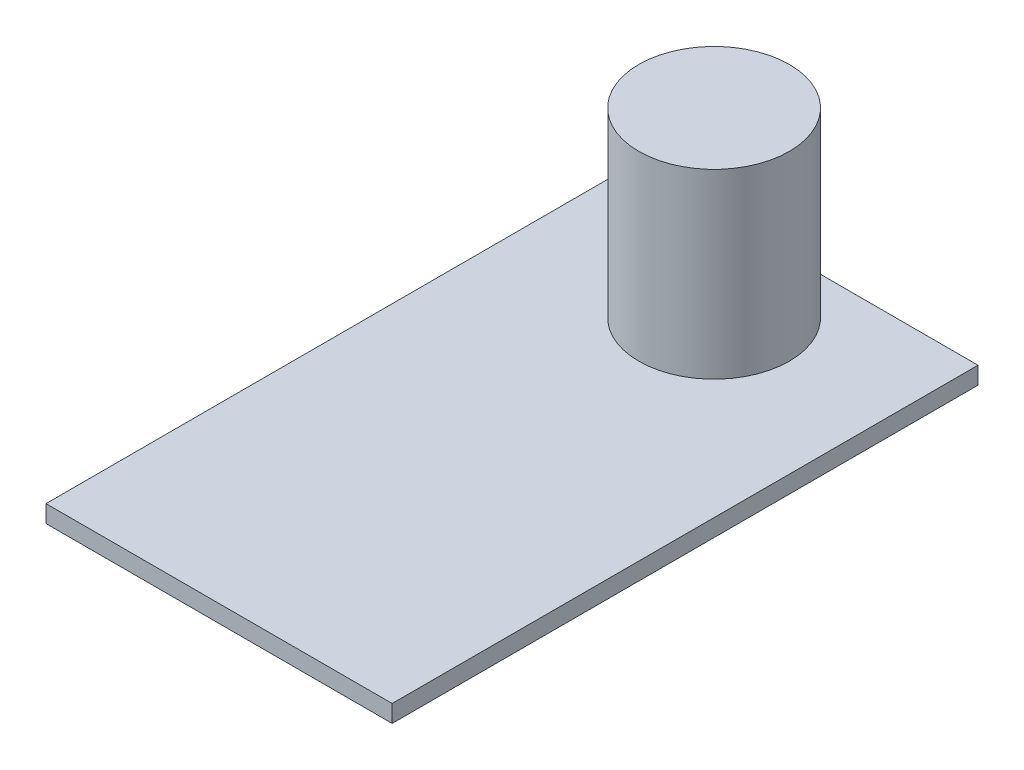
ISO-10303-21;
HEADER;
FILE_DESCRIPTION(('STEP AP214'),'2;1');
FILE_NAME('part.step','',(''),(''),'','','');
FILE_SCHEMA(('AUTOMOTIVE_DESIGN { 1 0 10303 214 1 1 1 1 }'));
ENDSEC;
DATA;
#1=APPLICATION_CONTEXT('core data for automotive mechanical design processes');
#2=APPLICATION_PROTOCOL_DEFINITION('international standard','automotive_design',2000,#1);
#3=PRODUCT_CONTEXT('',#1,'mechanical');
#4=PRODUCT('Part','Part','',(#3));
#5=PRODUCT_RELATED_PRODUCT_CATEGORY('part','',(#4));
#6=PRODUCT_DEFINITION_FORMATION('','',#4);
#7=PRODUCT_DEFINITION_CONTEXT('part definition',#1,'design');
#8=PRODUCT_DEFINITION('design','',#6,#7);
#9=PRODUCT_DEFINITION_SHAPE('','',#8);
#10=(LENGTH_UNIT() NAMED_UNIT(*) SI_UNIT(.MILLI.,.METRE.));
#11=(NAMED_UNIT(*) PLANE_ANGLE_UNIT() SI_UNIT($,.RADIAN.));
#12=(NAMED_UNIT(*) SI_UNIT($,.STERADIAN.) SOLID_ANGLE_UNIT());
#13=UNCERTAINTY_MEASURE_WITH_UNIT(LENGTH_MEASURE(1.E-05),#10,'distance_accuracy_value','');
#14=(GEOMETRIC_REPRESENTATION_CONTEXT(3) GLOBAL_UNCERTAINTY_ASSIGNED_CONTEXT((#13)) GLOBAL_UNIT_ASSIGNED_CONTEXT((#10,
#11,#12)) REPRESENTATION_CONTEXT('',''));
#15=CARTESIAN_POINT('',(0.,0.,0.));
#16=DIRECTION('',(0.,0.,1.));
#17=DIRECTION('',(1.,0.,0.));
#18=AXIS2_PLACEMENT_3D('',#15,#16,#17);
#19=CARTESIAN_POINT('',(0.,2.,0.));
#20=DIRECTION('',(0.,1.,0.));
#21=DIRECTION('',(0.,0.,1.));
#22=AXIS2_PLACEMENT_3D('',#19,#20,#21);
#23=PLANE('',#22);
#24=DIRECTION('',(0.,0.,1.));
#25=VECTOR('',#24,1.);
#26=CARTESIAN_POINT('',(-40.,2.,-67.7));
#27=LINE('',#26,#25);
#28=CARTESIAN_POINT('',(-40.,2.,-67.7));
#29=VERTEX_POINT('',#28);
#30=CARTESIAN_POINT('',(-40.,2.,0.));
#31=VERTEX_POINT('',#30);
#32=EDGE_CURVE('E88',#29,#31,#27,.T.);
#33=ORIENTED_EDGE('',*,*,#32,.T.);
#34=DIRECTION('',(1.,0.,0.));
#35=VECTOR('',#34,1.);
#36=CARTESIAN_POINT('',(-40.,2.,0.));
#37=LINE('',#36,#35);
#38=CARTESIAN_POINT('',(0.,2.,0.));
#39=VERTEX_POINT('',#38);
#40=EDGE_CURVE('E83',#31,#39,#37,.T.);
#41=ORIENTED_EDGE('',*,*,#40,.T.);
#42=DIRECTION('',(0.,0.,-1.));
#43=VECTOR('',#42,1.);
#44=CARTESIAN_POINT('',(0.,2.,-67.7));
#45=LINE('',#44,#43);
#46=CARTESIAN_POINT('',(0.,2.,-67.7));
#47=VERTEX_POINT('',#46);
#48=EDGE_CURVE('E86',#39,#47,#45,.T.);
#49=ORIENTED_EDGE('',*,*,#48,.T.);
#50=DIRECTION('',(-1.,0.,0.));
#51=VECTOR('',#50,1.);
#52=CARTESIAN_POINT('',(-40.,2.,-67.7));
#53=LINE('',#52,#51);
#54=EDGE_CURVE('E53',#47,#29,#53,.T.);
#55=ORIENTED_EDGE('',*,*,#54,.T.);
#56=EDGE_LOOP('',(#33,#41,#49,#55));
#57=FACE_BOUND('',#56,.T.);
#58=CARTESIAN_POINT('',(-20.,2.,-57.2));
#59=DIRECTION('',(0.,1.,0.));
#60=DIRECTION('',(0.,0.,1.));
#61=AXIS2_PLACEMENT_3D('',#58,#59,#60);
#62=CIRCLE('',#61,8.7);
#63=CARTESIAN_POINT('',(-20.,2.,-65.9));
#64=VERTEX_POINT('',#63);
#65=EDGE_CURVE('E114',#64,#64,#62,.T.);
#66=ORIENTED_EDGE('',*,*,#65,.F.);
#67=EDGE_LOOP('',(#66));
#68=FACE_BOUND('',#67,.T.);
#69=ADVANCED_FACE('F36',(#57,#68),#23,.T.);
#70=CARTESIAN_POINT('',(-40.,2.,-67.7));
#71=DIRECTION('',(1.,0.,0.));
#72=DIRECTION('',(0.,0.,-1.));
#73=AXIS2_PLACEMENT_3D('',#70,#71,#72);
#74=PLANE('',#73);
#75=DIRECTION('',(0.,0.,1.));
#76=VECTOR('',#75,1.);
#77=CARTESIAN_POINT('',(-40.,0.,-67.7));
#78=LINE('',#77,#76);
#79=CARTESIAN_POINT('',(-40.,0.,-67.7));
#80=VERTEX_POINT('',#79);
#81=CARTESIAN_POINT('',(-40.,0.,0.));
#82=VERTEX_POINT('',#81);
#83=EDGE_CURVE('E100',#80,#82,#78,.T.);
#84=ORIENTED_EDGE('',*,*,#83,.T.);
#85=DIRECTION('',(0.,-1.,0.));
#86=VECTOR('',#85,1.);
#87=CARTESIAN_POINT('',(-40.,2.,0.));
#88=LINE('',#87,#86);
#89=EDGE_CURVE('E11',#31,#82,#88,.T.);
#90=ORIENTED_EDGE('',*,*,#89,.F.);
#91=ORIENTED_EDGE('',*,*,#32,.F.);
#92=DIRECTION('',(0.,-1.,0.));
#93=VECTOR('',#92,1.);
#94=CARTESIAN_POINT('',(-40.,2.,-67.7));
#95=LINE('',#94,#93);
#96=EDGE_CURVE('E96',#29,#80,#95,.T.);
#97=ORIENTED_EDGE('',*,*,#96,.T.);
#98=EDGE_LOOP('',(#84,#90,#91,#97));
#99=FACE_BOUND('',#98,.T.);
#100=ADVANCED_FACE('F38',(#99),#74,.F.);
#101=CARTESIAN_POINT('',(-40.,2.,0.));
#102=DIRECTION('',(0.,0.,-1.));
#103=DIRECTION('',(-1.,0.,0.));
#104=AXIS2_PLACEMENT_3D('',#101,#102,#103);
#105=PLANE('',#104);
#106=DIRECTION('',(1.,0.,0.));
#107=VECTOR('',#106,1.);
#108=CARTESIAN_POINT('',(-40.,0.,0.));
#109=LINE('',#108,#107);
#110=CARTESIAN_POINT('',(0.,0.,0.));
#111=VERTEX_POINT('',#110);
#112=EDGE_CURVE('E92',#82,#111,#109,.T.);
#113=ORIENTED_EDGE('',*,*,#112,.T.);
#114=DIRECTION('',(0.,-1.,0.));
#115=VECTOR('',#114,1.);
#116=CARTESIAN_POINT('',(0.,2.,0.));
#117=LINE('',#116,#115);
#118=EDGE_CURVE('E45',#39,#111,#117,.T.);
#119=ORIENTED_EDGE('',*,*,#118,.F.);
#120=ORIENTED_EDGE('',*,*,#40,.F.);
#121=ORIENTED_EDGE('',*,*,#89,.T.);
#122=EDGE_LOOP('',(#113,#119,#120,#121));
#123=FACE_BOUND('',#122,.T.);
#124=ADVANCED_FACE('F91',(#123),#105,.F.);
#125=CARTESIAN_POINT('',(0.,2.,-67.7));
#126=DIRECTION('',(-1.,0.,0.));
#127=DIRECTION('',(0.,0.,1.));
#128=AXIS2_PLACEMENT_3D('',#125,#126,#127);
#129=PLANE('',#128);
#130=DIRECTION('',(0.,0.,-1.));
#131=VECTOR('',#130,1.);
#132=CARTESIAN_POINT('',(0.,0.,-67.7));
#133=LINE('',#132,#131);
#134=CARTESIAN_POINT('',(0.,0.,-67.7));
#135=VERTEX_POINT('',#134);
#136=EDGE_CURVE('E70',#111,#135,#133,.T.);
#137=ORIENTED_EDGE('',*,*,#136,.T.);
#138=DIRECTION('',(0.,-1.,0.));
#139=VECTOR('',#138,1.);
#140=CARTESIAN_POINT('',(0.,2.,-67.7));
#141=LINE('',#140,#139);
#142=EDGE_CURVE('E93',#47,#135,#141,.T.);
#143=ORIENTED_EDGE('',*,*,#142,.F.);
#144=ORIENTED_EDGE('',*,*,#48,.F.);
#145=ORIENTED_EDGE('',*,*,#118,.T.);
#146=EDGE_LOOP('',(#137,#143,#144,#145));
#147=FACE_BOUND('',#146,.T.);
#148=ADVANCED_FACE('F94',(#147),#129,.F.);
#149=CARTESIAN_POINT('',(-40.,2.,-67.7));
#150=DIRECTION('',(0.,0.,1.));
#151=DIRECTION('',(1.,0.,0.));
#152=AXIS2_PLACEMENT_3D('',#149,#150,#151);
#153=PLANE('',#152);
#154=DIRECTION('',(-1.,0.,0.));
#155=VECTOR('',#154,1.);
#156=CARTESIAN_POINT('',(-40.,0.,-67.7));
#157=LINE('',#156,#155);
#158=EDGE_CURVE('E76',#135,#80,#157,.T.);
#159=ORIENTED_EDGE('',*,*,#158,.T.);
#160=ORIENTED_EDGE('',*,*,#96,.F.);
#161=ORIENTED_EDGE('',*,*,#54,.F.);
#162=ORIENTED_EDGE('',*,*,#142,.T.);
#163=EDGE_LOOP('',(#159,#160,#161,#162));
#164=FACE_BOUND('',#163,.T.);
#165=ADVANCED_FACE('F108',(#164),#153,.F.);
#166=CARTESIAN_POINT('',(0.,0.,0.));
#167=DIRECTION('',(0.,1.,0.));
#168=DIRECTION('',(0.,0.,1.));
#169=AXIS2_PLACEMENT_3D('',#166,#167,#168);
#170=PLANE('',#169);
#171=ORIENTED_EDGE('',*,*,#83,.F.);
#172=ORIENTED_EDGE('',*,*,#158,.F.);
#173=ORIENTED_EDGE('',*,*,#136,.F.);
#174=ORIENTED_EDGE('',*,*,#112,.F.);
#175=EDGE_LOOP('',(#171,#172,#173,#174));
#176=FACE_BOUND('',#175,.T.);
#177=ADVANCED_FACE('F111',(#176),#170,.F.);
#178=CARTESIAN_POINT('',(-20.,23.,-57.2));
#179=DIRECTION('',(0.,-1.,0.));
#180=DIRECTION('',(0.,0.,-1.));
#181=AXIS2_PLACEMENT_3D('',#178,#179,#180);
#182=CYLINDRICAL_SURFACE('',#181,8.7);
#183=CARTESIAN_POINT('',(-20.,23.,-57.2));
#184=DIRECTION('',(0.,1.,0.));
#185=DIRECTION('',(0.,0.,1.));
#186=AXIS2_PLACEMENT_3D('',#183,#184,#185);
#187=CIRCLE('',#186,8.7);
#188=CARTESIAN_POINT('',(-20.,23.,-65.9));
#189=VERTEX_POINT('',#188);
#190=EDGE_CURVE('E103',#189,#189,#187,.T.);
#191=CARTESIAN_POINT('',(-20.,23.,-65.9));
#192=CARTESIAN_POINT('',(-20.,22.78125,-65.9));
#193=CARTESIAN_POINT('',(-20.,22.5625,-65.9));
#194=CARTESIAN_POINT('',(-20.,22.125,-65.9));
#195=CARTESIAN_POINT('',(-20.,21.90625,-65.9));
#196=CARTESIAN_POINT('',(-20.,21.46875,-65.9));
#197=CARTESIAN_POINT('',(-20.,21.25,-65.9));
#198=CARTESIAN_POINT('',(-20.,20.8125,-65.9));
#199=CARTESIAN_POINT('',(-20.,20.59375,-65.9));
#200=CARTESIAN_POINT('',(-20.,20.15625,-65.9));
#201=CARTESIAN_POINT('',(-20.,19.9375,-65.9));
#202=CARTESIAN_POINT('',(-20.,19.5,-65.9));
#203=CARTESIAN_POINT('',(-20.,19.28125,-65.9));
#204=CARTESIAN_POINT('',(-20.,18.84375,-65.9));
#205=CARTESIAN_POINT('',(-20.,18.625,-65.9));
#206=CARTESIAN_POINT('',(-20.,18.1875,-65.9));
#207=CARTESIAN_POINT('',(-20.,17.96875,-65.9));
#208=CARTESIAN_POINT('',(-20.,17.53125,-65.9));
#209=CARTESIAN_POINT('',(-20.,17.3125,-65.9));
#210=CARTESIAN_POINT('',(-20.,16.875,-65.9));
#211=CARTESIAN_POINT('',(-20.,16.65625,-65.9));
#212=CARTESIAN_POINT('',(-20.,16.21875,-65.9));
#213=CARTESIAN_POINT('',(-20.,16.,-65.9));
#214=CARTESIAN_POINT('',(-20.,15.5625,-65.9));
#215=CARTESIAN_POINT('',(-20.,15.34375,-65.9));
#216=CARTESIAN_POINT('',(-20.,14.90625,-65.9));
#217=CARTESIAN_POINT('',(-20.,14.6875,-65.9));
#218=CARTESIAN_POINT('',(-20.,14.25,-65.9));
#219=CARTESIAN_POINT('',(-20.,14.03125,-65.9));
#220=CARTESIAN_POINT('',(-20.,13.59375,-65.9));
#221=CARTESIAN_POINT('',(-20.,13.375,-65.9));
#222=CARTESIAN_POINT('',(-20.,12.9375,-65.9));
#223=CARTESIAN_POINT('',(-20.,12.71875,-65.9));
#224=CARTESIAN_POINT('',(-20.,12.28125,-65.9));
#225=CARTESIAN_POINT('',(-20.,12.0625,-65.9));
#226=CARTESIAN_POINT('',(-20.,11.625,-65.9));
#227=CARTESIAN_POINT('',(-20.,11.40625,-65.9));
#228=CARTESIAN_POINT('',(-20.,10.96875,-65.9));
#229=CARTESIAN_POINT('',(-20.,10.75,-65.9));
#230=CARTESIAN_POINT('',(-20.,10.3125,-65.9));
#231=CARTESIAN_POINT('',(-20.,10.09375,-65.9));
#232=CARTESIAN_POINT('',(-20.,9.65625,-65.9));
#233=CARTESIAN_POINT('',(-20.,9.4375,-65.9));
#234=CARTESIAN_POINT('',(-20.,9.,-65.9));
#235=CARTESIAN_POINT('',(-20.,8.78125,-65.9));
#236=CARTESIAN_POINT('',(-20.,8.34375,-65.9));
#237=CARTESIAN_POINT('',(-20.,8.125,-65.9));
#238=CARTESIAN_POINT('',(-20.,7.6875,-65.9));
#239=CARTESIAN_POINT('',(-20.,7.46875,-65.9));
#240=CARTESIAN_POINT('',(-20.,7.03125,-65.9));
#241=CARTESIAN_POINT('',(-20.,6.8125,-65.9));
#242=CARTESIAN_POINT('',(-20.,6.375,-65.9));
#243=CARTESIAN_POINT('',(-20.,6.15625,-65.9));
#244=CARTESIAN_POINT('',(-20.,5.71875,-65.9));
#245=CARTESIAN_POINT('',(-20.,5.5,-65.9));
#246=CARTESIAN_POINT('',(-20.,5.0625,-65.9));
#247=CARTESIAN_POINT('',(-20.,4.84375,-65.9));
#248=CARTESIAN_POINT('',(-20.,4.40625,-65.9));
#249=CARTESIAN_POINT('',(-20.,4.1875,-65.9));
#250=CARTESIAN_POINT('',(-20.,3.75,-65.9));
#251=CARTESIAN_POINT('',(-20.,3.53125,-65.9));
#252=CARTESIAN_POINT('',(-20.,3.09375,-65.9));
#253=CARTESIAN_POINT('',(-20.,2.875,-65.9));
#254=CARTESIAN_POINT('',(-20.,2.4375,-65.9));
#255=CARTESIAN_POINT('',(-20.,2.21875,-65.9));
#256=CARTESIAN_POINT('',(-20.,2.,-65.9));
#257=B_SPLINE_CURVE_WITH_KNOTS('',3,(#191,#192,#193,#194,#195,#196,#197,#198,#199,#200,#201,
#202,#203,#204,#205,#206,#207,#208,#209,#210,#211,#212,#213,#214,#215,#216,#217,#218,#219,#220,
#221,#222,#223,#224,#225,#226,#227,#228,#229,#230,#231,#232,#233,#234,#235,#236,#237,#238,#239,
#240,#241,#242,#243,#244,#245,#246,#247,#248,#249,#250,#251,#252,#253,#254,#255,#256),
.UNSPECIFIED.,.F.,.F.,(4,2,2,2,2,2,2,2,2,2,2,2,2,2,2,2,2,2,2,2,2,2,2,2,2,2,2,2,2,2,2,2,4),(0.,
0.656250000000001,1.3125,1.96875,2.625,3.28125,3.9375,4.59375,5.25,5.90625,6.5625,7.21875,7.875,
8.53125,9.1875,9.84375,10.5,11.15625,11.8125,12.46875,13.125,13.78125,14.4375,15.09375,15.75,
16.40625,17.0625,17.71875,18.375,19.03125,19.6875,20.34375,21.),.UNSPECIFIED.);
#258=EDGE_CURVE('BSEAM122',#189,#64,#257,.T.);
#259=ORIENTED_EDGE('',*,*,#190,.F.);
#260=ORIENTED_EDGE('',*,*,#65,.T.);
#261=ORIENTED_EDGE('',*,*,#258,.T.);
#262=ORIENTED_EDGE('',*,*,#258,.F.);
#263=EDGE_LOOP('',(#259,#261,#260,#262));
#264=FACE_BOUND('',#263,.T.);
#265=ADVANCED_FACE('F122',(#264),#182,.T.);
#266=CARTESIAN_POINT('',(-20.,23.,-57.2));
#267=DIRECTION('',(0.,1.,0.));
#268=DIRECTION('',(0.,0.,1.));
#269=AXIS2_PLACEMENT_3D('',#266,#267,#268);
#270=PLANE('',#269);
#271=ORIENTED_EDGE('',*,*,#190,.T.);
#272=EDGE_LOOP('',(#271));
#273=FACE_BOUND('',#272,.T.);
#274=ADVANCED_FACE('F120',(#273),#270,.T.);
#275=CLOSED_SHELL('',(#69,#100,#124,#148,#165,#177,#265,#274));
#276=MANIFOLD_SOLID_BREP('B2',#275);
#277=ADVANCED_BREP_SHAPE_REPRESENTATION('',(#18,#276),#14);
#278=SHAPE_DEFINITION_REPRESENTATION(#9,#277);
ENDSEC;
END-ISO-10303-21;
